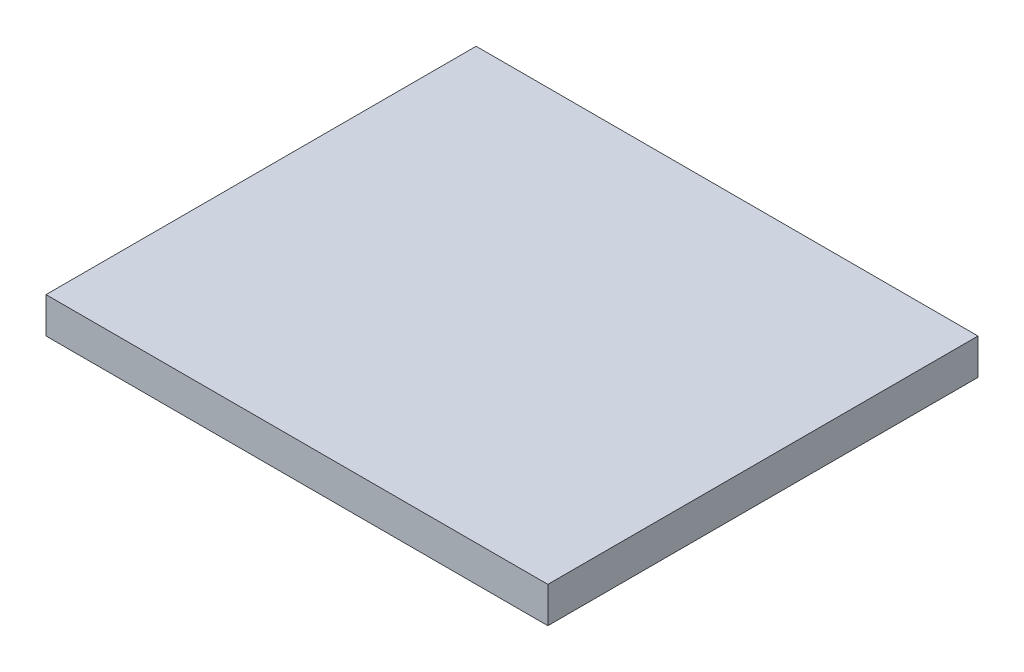
ISO-10303-21;
HEADER;
FILE_DESCRIPTION(('STEP AP214'),'2;1');
FILE_NAME('part.step','',(''),(''),'','','');
FILE_SCHEMA(('AUTOMOTIVE_DESIGN { 1 0 10303 214 1 1 1 1 }'));
ENDSEC;
DATA;
#1=APPLICATION_CONTEXT('core data for automotive mechanical design processes');
#2=APPLICATION_PROTOCOL_DEFINITION('international standard','automotive_design',2000,#1);
#3=PRODUCT_CONTEXT('',#1,'mechanical');
#4=PRODUCT('Part','Part','',(#3));
#5=PRODUCT_RELATED_PRODUCT_CATEGORY('part','',(#4));
#6=PRODUCT_DEFINITION_FORMATION('','',#4);
#7=PRODUCT_DEFINITION_CONTEXT('part definition',#1,'design');
#8=PRODUCT_DEFINITION('design','',#6,#7);
#9=PRODUCT_DEFINITION_SHAPE('','',#8);
#10=(LENGTH_UNIT() NAMED_UNIT(*) SI_UNIT(.MILLI.,.METRE.));
#11=(NAMED_UNIT(*) PLANE_ANGLE_UNIT() SI_UNIT($,.RADIAN.));
#12=(NAMED_UNIT(*) SI_UNIT($,.STERADIAN.) SOLID_ANGLE_UNIT());
#13=UNCERTAINTY_MEASURE_WITH_UNIT(LENGTH_MEASURE(1.E-05),#10,'distance_accuracy_value','');
#14=(GEOMETRIC_REPRESENTATION_CONTEXT(3) GLOBAL_UNCERTAINTY_ASSIGNED_CONTEXT((#13)) GLOBAL_UNIT_ASSIGNED_CONTEXT((#10,
#11,#12)) REPRESENTATION_CONTEXT('',''));
#15=CARTESIAN_POINT('',(0.,0.,0.));
#16=DIRECTION('',(0.,0.,1.));
#17=DIRECTION('',(1.,0.,0.));
#18=AXIS2_PLACEMENT_3D('',#15,#16,#17);
#19=CARTESIAN_POINT('',(1.75,0.125,1.5));
#20=DIRECTION('',(-1.,0.,0.));
#21=DIRECTION('',(0.,0.,1.));
#22=AXIS2_PLACEMENT_3D('',#19,#20,#21);
#23=PLANE('',#22);
#24=DIRECTION('',(0.,0.,-1.));
#25=VECTOR('',#24,1.);
#26=CARTESIAN_POINT('',(1.75,-0.125,1.5));
#27=LINE('',#26,#25);
#28=CARTESIAN_POINT('',(1.75,-0.125,1.5));
#29=VERTEX_POINT('',#28);
#30=CARTESIAN_POINT('',(1.75,-0.125,-1.5));
#31=VERTEX_POINT('',#30);
#32=EDGE_CURVE('E107',#29,#31,#27,.T.);
#33=ORIENTED_EDGE('',*,*,#32,.T.);
#34=DIRECTION('',(0.,-1.,0.));
#35=VECTOR('',#34,1.);
#36=CARTESIAN_POINT('',(1.75,0.125,-1.5));
#37=LINE('',#36,#35);
#38=CARTESIAN_POINT('',(1.75,0.125,-1.5));
#39=VERTEX_POINT('',#38);
#40=EDGE_CURVE('E11',#39,#31,#37,.T.);
#41=ORIENTED_EDGE('',*,*,#40,.F.);
#42=DIRECTION('',(0.,0.,-1.));
#43=VECTOR('',#42,1.);
#44=CARTESIAN_POINT('',(1.75,0.125,1.5));
#45=LINE('',#44,#43);
#46=CARTESIAN_POINT('',(1.75,0.125,1.5));
#47=VERTEX_POINT('',#46);
#48=EDGE_CURVE('E91',#47,#39,#45,.T.);
#49=ORIENTED_EDGE('',*,*,#48,.F.);
#50=DIRECTION('',(0.,-1.,0.));
#51=VECTOR('',#50,1.);
#52=CARTESIAN_POINT('',(1.75,0.125,1.5));
#53=LINE('',#52,#51);
#54=EDGE_CURVE('E103',#47,#29,#53,.T.);
#55=ORIENTED_EDGE('',*,*,#54,.T.);
#56=EDGE_LOOP('',(#33,#41,#49,#55));
#57=FACE_BOUND('',#56,.T.);
#58=ADVANCED_FACE('F39',(#57),#23,.F.);
#59=CARTESIAN_POINT('',(-1.75,0.125,-1.5));
#60=DIRECTION('',(0.,0.,1.));
#61=DIRECTION('',(1.,0.,0.));
#62=AXIS2_PLACEMENT_3D('',#59,#60,#61);
#63=PLANE('',#62);
#64=DIRECTION('',(-1.,0.,0.));
#65=VECTOR('',#64,1.);
#66=CARTESIAN_POINT('',(-1.75,-0.125,-1.5));
#67=LINE('',#66,#65);
#68=CARTESIAN_POINT('',(-1.75,-0.125,-1.5));
#69=VERTEX_POINT('',#68);
#70=EDGE_CURVE('E96',#31,#69,#67,.T.);
#71=ORIENTED_EDGE('',*,*,#70,.T.);
#72=DIRECTION('',(0.,-1.,0.));
#73=VECTOR('',#72,1.);
#74=CARTESIAN_POINT('',(-1.75,0.125,-1.5));
#75=LINE('',#74,#73);
#76=CARTESIAN_POINT('',(-1.75,0.125,-1.5));
#77=VERTEX_POINT('',#76);
#78=EDGE_CURVE('E48',#77,#69,#75,.T.);
#79=ORIENTED_EDGE('',*,*,#78,.F.);
#80=DIRECTION('',(-1.,0.,0.));
#81=VECTOR('',#80,1.);
#82=CARTESIAN_POINT('',(-1.75,0.125,-1.5));
#83=LINE('',#82,#81);
#84=EDGE_CURVE('E86',#39,#77,#83,.T.);
#85=ORIENTED_EDGE('',*,*,#84,.F.);
#86=ORIENTED_EDGE('',*,*,#40,.T.);
#87=EDGE_LOOP('',(#71,#79,#85,#86));
#88=FACE_BOUND('',#87,.T.);
#89=ADVANCED_FACE('F95',(#88),#63,.F.);
#90=CARTESIAN_POINT('',(-1.75,0.125,1.5));
#91=DIRECTION('',(1.,0.,0.));
#92=DIRECTION('',(0.,0.,-1.));
#93=AXIS2_PLACEMENT_3D('',#90,#91,#92);
#94=PLANE('',#93);
#95=DIRECTION('',(0.,0.,1.));
#96=VECTOR('',#95,1.);
#97=CARTESIAN_POINT('',(-1.75,-0.125,1.5));
#98=LINE('',#97,#96);
#99=CARTESIAN_POINT('',(-1.75,-0.125,1.5));
#100=VERTEX_POINT('',#99);
#101=EDGE_CURVE('E73',#69,#100,#98,.T.);
#102=ORIENTED_EDGE('',*,*,#101,.T.);
#103=DIRECTION('',(0.,-1.,0.));
#104=VECTOR('',#103,1.);
#105=CARTESIAN_POINT('',(-1.75,0.125,1.5));
#106=LINE('',#105,#104);
#107=CARTESIAN_POINT('',(-1.75,0.125,1.5));
#108=VERTEX_POINT('',#107);
#109=EDGE_CURVE('E98',#108,#100,#106,.T.);
#110=ORIENTED_EDGE('',*,*,#109,.F.);
#111=DIRECTION('',(0.,0.,1.));
#112=VECTOR('',#111,1.);
#113=CARTESIAN_POINT('',(-1.75,0.125,1.5));
#114=LINE('',#113,#112);
#115=EDGE_CURVE('E89',#77,#108,#114,.T.);
#116=ORIENTED_EDGE('',*,*,#115,.F.);
#117=ORIENTED_EDGE('',*,*,#78,.T.);
#118=EDGE_LOOP('',(#102,#110,#116,#117));
#119=FACE_BOUND('',#118,.T.);
#120=ADVANCED_FACE('F99',(#119),#94,.F.);
#121=CARTESIAN_POINT('',(-1.75,0.125,1.5));
#122=DIRECTION('',(0.,0.,-1.));
#123=DIRECTION('',(-1.,0.,0.));
#124=AXIS2_PLACEMENT_3D('',#121,#122,#123);
#125=PLANE('',#124);
#126=DIRECTION('',(1.,0.,0.));
#127=VECTOR('',#126,1.);
#128=CARTESIAN_POINT('',(-1.75,-0.125,1.5));
#129=LINE('',#128,#127);
#130=EDGE_CURVE('E79',#100,#29,#129,.T.);
#131=ORIENTED_EDGE('',*,*,#130,.T.);
#132=ORIENTED_EDGE('',*,*,#54,.F.);
#133=DIRECTION('',(1.,0.,0.));
#134=VECTOR('',#133,1.);
#135=CARTESIAN_POINT('',(-1.75,0.125,1.5));
#136=LINE('',#135,#134);
#137=EDGE_CURVE('E56',#108,#47,#136,.T.);
#138=ORIENTED_EDGE('',*,*,#137,.F.);
#139=ORIENTED_EDGE('',*,*,#109,.T.);
#140=EDGE_LOOP('',(#131,#132,#138,#139));
#141=FACE_BOUND('',#140,.T.);
#142=ADVANCED_FACE('F120',(#141),#125,.F.);
#143=CARTESIAN_POINT('',(0.,0.125,0.));
#144=DIRECTION('',(0.,-1.,0.));
#145=DIRECTION('',(0.,0.,-1.));
#146=AXIS2_PLACEMENT_3D('',#143,#144,#145);
#147=PLANE('',#146);
#148=ORIENTED_EDGE('',*,*,#48,.T.);
#149=ORIENTED_EDGE('',*,*,#84,.T.);
#150=ORIENTED_EDGE('',*,*,#115,.T.);
#151=ORIENTED_EDGE('',*,*,#137,.T.);
#152=EDGE_LOOP('',(#148,#149,#150,#151));
#153=FACE_BOUND('',#152,.T.);
#154=ADVANCED_FACE('F87',(#153),#147,.F.);
#155=CARTESIAN_POINT('',(0.,-0.125,0.));
#156=DIRECTION('',(0.,-1.,0.));
#157=DIRECTION('',(0.,0.,-1.));
#158=AXIS2_PLACEMENT_3D('',#155,#156,#157);
#159=PLANE('',#158);
#160=ORIENTED_EDGE('',*,*,#32,.F.);
#161=ORIENTED_EDGE('',*,*,#130,.F.);
#162=ORIENTED_EDGE('',*,*,#101,.F.);
#163=ORIENTED_EDGE('',*,*,#70,.F.);
#164=EDGE_LOOP('',(#160,#161,#162,#163));
#165=FACE_BOUND('',#164,.T.);
#166=ADVANCED_FACE('F123',(#165),#159,.T.);
#167=CLOSED_SHELL('',(#58,#89,#120,#142,#154,#166));
#168=MANIFOLD_SOLID_BREP('B2',#167);
#169=ADVANCED_BREP_SHAPE_REPRESENTATION('',(#18,#168),#14);
#170=SHAPE_DEFINITION_REPRESENTATION(#9,#169);
ENDSEC;
END-ISO-10303-21;
